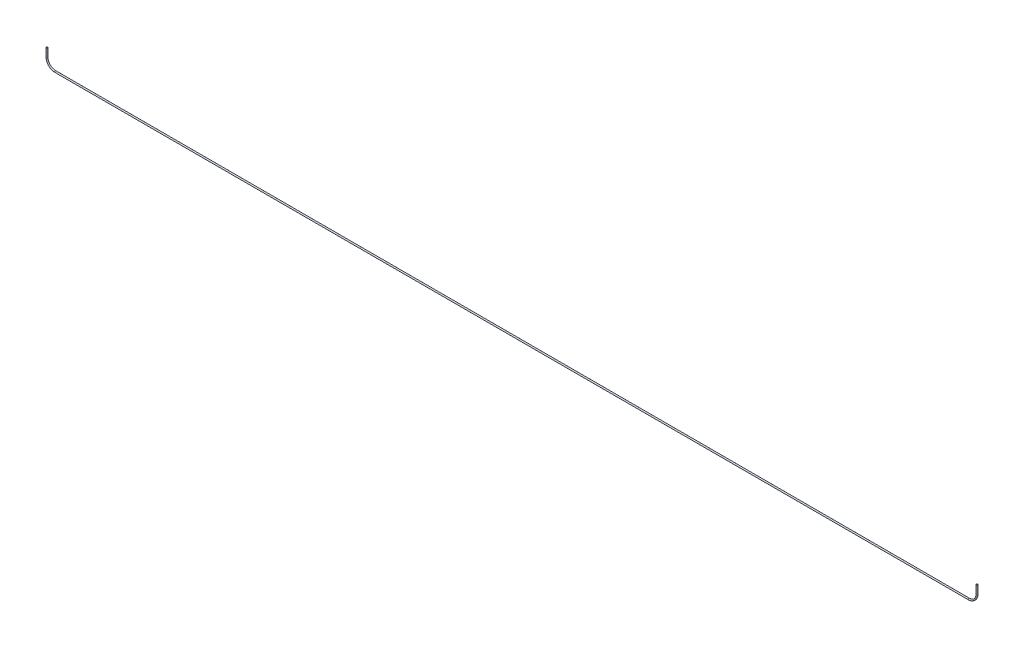
ISO-10303-21;
HEADER;
FILE_DESCRIPTION(('STEP AP214'),'2;1');
FILE_NAME('part.step','',(''),(''),'','','');
FILE_SCHEMA(('AUTOMOTIVE_DESIGN { 1 0 10303 214 1 1 1 1 }'));
ENDSEC;
DATA;
#1=APPLICATION_CONTEXT('core data for automotive mechanical design processes');
#2=APPLICATION_PROTOCOL_DEFINITION('international standard','automotive_design',2000,#1);
#3=PRODUCT_CONTEXT('',#1,'mechanical');
#4=PRODUCT('Part','Part','',(#3));
#5=PRODUCT_RELATED_PRODUCT_CATEGORY('part','',(#4));
#6=PRODUCT_DEFINITION_FORMATION('','',#4);
#7=PRODUCT_DEFINITION_CONTEXT('part definition',#1,'design');
#8=PRODUCT_DEFINITION('design','',#6,#7);
#9=PRODUCT_DEFINITION_SHAPE('','',#8);
#10=(LENGTH_UNIT() NAMED_UNIT(*) SI_UNIT(.MILLI.,.METRE.));
#11=(NAMED_UNIT(*) PLANE_ANGLE_UNIT() SI_UNIT($,.RADIAN.));
#12=(NAMED_UNIT(*) SI_UNIT($,.STERADIAN.) SOLID_ANGLE_UNIT());
#13=UNCERTAINTY_MEASURE_WITH_UNIT(LENGTH_MEASURE(1.E-05),#10,'distance_accuracy_value','');
#14=(GEOMETRIC_REPRESENTATION_CONTEXT(3) GLOBAL_UNCERTAINTY_ASSIGNED_CONTEXT((#13)) GLOBAL_UNIT_ASSIGNED_CONTEXT((#10,
#11,#12)) REPRESENTATION_CONTEXT('',''));
#15=CARTESIAN_POINT('',(0.,0.,0.));
#16=DIRECTION('',(0.,0.,1.));
#17=DIRECTION('',(1.,0.,0.));
#18=AXIS2_PLACEMENT_3D('',#15,#16,#17);
#19=CARTESIAN_POINT('',(-4200.,149.999999999999,0.));
#20=DIRECTION('',(0.,1.,0.));
#21=DIRECTION('',(0.,0.,-1.));
#22=AXIS2_PLACEMENT_3D('',#19,#20,#21);
#23=PLANE('',#22);
#24=CARTESIAN_POINT('',(-4200.,149.999999999999,0.));
#25=DIRECTION('',(0.,1.,0.));
#26=DIRECTION('',(0.,0.,-1.));
#27=AXIS2_PLACEMENT_3D('',#24,#25,#26);
#28=CIRCLE('',#27,6.3500000000003);
#29=CARTESIAN_POINT('',(-4200.,149.999999999999,-6.3500000000003));
#30=VERTEX_POINT('',#29);
#31=EDGE_CURVE('E69',#30,#30,#28,.T.);
#32=ORIENTED_EDGE('',*,*,#31,.T.);
#33=EDGE_LOOP('',(#32));
#34=FACE_BOUND('',#33,.T.);
#35=ADVANCED_FACE('F47',(#34),#23,.T.);
#36=CARTESIAN_POINT('',(4200.,150.,0.));
#37=DIRECTION('',(0.,-1.,0.));
#38=DIRECTION('',(0.,0.,-1.));
#39=AXIS2_PLACEMENT_3D('',#36,#37,#38);
#40=PLANE('',#39);
#41=CARTESIAN_POINT('',(4200.,150.,0.));
#42=DIRECTION('',(0.,-1.,0.));
#43=DIRECTION('',(0.,0.,-1.));
#44=AXIS2_PLACEMENT_3D('',#41,#42,#43);
#45=CIRCLE('',#44,6.3500000000003);
#46=CARTESIAN_POINT('',(4200.,150.,-6.3500000000003));
#47=VERTEX_POINT('',#46);
#48=EDGE_CURVE('E11',#47,#47,#45,.T.);
#49=ORIENTED_EDGE('',*,*,#48,.F.);
#50=EDGE_LOOP('',(#49));
#51=FACE_BOUND('',#50,.T.);
#52=ADVANCED_FACE('F77',(#51),#40,.F.);
#53=CARTESIAN_POINT('',(-4200.,149.999999999999,0.));
#54=DIRECTION('',(0.,-1.,0.));
#55=DIRECTION('',(0.,0.,-1.));
#56=AXIS2_PLACEMENT_3D('',#53,#54,#55);
#57=CYLINDRICAL_SURFACE('',#56,6.3500000000003);
#58=CARTESIAN_POINT('',(-4200.,74.999999999999,0.));
#59=DIRECTION('',(0.,1.,0.));
#60=DIRECTION('',(0.,0.,-1.));
#61=AXIS2_PLACEMENT_3D('',#58,#59,#60);
#62=CIRCLE('',#61,6.3500000000003);
#63=CARTESIAN_POINT('',(-4206.35,74.999999999999,0.));
#64=VERTEX_POINT('',#63);
#65=EDGE_CURVE('E66',#64,#64,#62,.T.);
#66=ORIENTED_EDGE('',*,*,#65,.T.);
#67=EDGE_LOOP('',(#66));
#68=FACE_BOUND('',#67,.T.);
#69=ORIENTED_EDGE('',*,*,#31,.F.);
#70=EDGE_LOOP('',(#69));
#71=FACE_BOUND('',#70,.T.);
#72=ADVANCED_FACE('F74',(#68,#71),#57,.T.);
#73=CARTESIAN_POINT('',(-4125.,74.999999999999,0.));
#74=DIRECTION('',(0.,0.,1.));
#75=DIRECTION('',(1.,0.,0.));
#76=AXIS2_PLACEMENT_3D('',#73,#74,#75);
#77=TOROIDAL_SURFACE('',#76,75.0000000000002,6.3500000000003);
#78=CARTESIAN_POINT('',(-4125.,-8.88178419700125E-13,0.));
#79=DIRECTION('',(-1.,0.,0.));
#80=DIRECTION('',(0.,0.,-1.));
#81=AXIS2_PLACEMENT_3D('',#78,#79,#80);
#82=CIRCLE('',#81,6.3500000000003);
#83=CARTESIAN_POINT('',(-4125.,-6.35000000000147,0.));
#84=VERTEX_POINT('',#83);
#85=EDGE_CURVE('E61',#84,#84,#82,.T.);
#86=CARTESIAN_POINT('',(-4125.,74.999999999999,0.));
#87=DIRECTION('',(0.,0.,1.));
#88=DIRECTION('',(1.,0.,0.));
#89=AXIS2_PLACEMENT_3D('',#86,#87,#88);
#90=CIRCLE('',#89,81.3500000000005);
#91=EDGE_CURVE('',#64,#84,#90,.T.);
#92=ORIENTED_EDGE('',*,*,#65,.F.);
#93=ORIENTED_EDGE('',*,*,#85,.T.);
#94=ORIENTED_EDGE('',*,*,#91,.T.);
#95=ORIENTED_EDGE('',*,*,#91,.F.);
#96=EDGE_LOOP('',(#92,#94,#93,#95));
#97=FACE_BOUND('',#96,.T.);
#98=ADVANCED_FACE('F76',(#97),#77,.T.);
#99=CARTESIAN_POINT('',(-4125.,-8.88178419700125E-13,0.));
#100=DIRECTION('',(1.,0.,0.));
#101=DIRECTION('',(0.,1.,0.));
#102=AXIS2_PLACEMENT_3D('',#99,#100,#101);
#103=CYLINDRICAL_SURFACE('',#102,6.3500000000003);
#104=CARTESIAN_POINT('',(4125.,0.,0.));
#105=DIRECTION('',(-1.,0.,0.));
#106=DIRECTION('',(0.,0.,-1.));
#107=AXIS2_PLACEMENT_3D('',#104,#105,#106);
#108=CIRCLE('',#107,6.3500000000003);
#109=CARTESIAN_POINT('',(4125.,-6.3500000000003,0.));
#110=VERTEX_POINT('',#109);
#111=EDGE_CURVE('E57',#110,#110,#108,.T.);
#112=ORIENTED_EDGE('',*,*,#111,.T.);
#113=EDGE_LOOP('',(#112));
#114=FACE_BOUND('',#113,.T.);
#115=ORIENTED_EDGE('',*,*,#85,.F.);
#116=EDGE_LOOP('',(#115));
#117=FACE_BOUND('',#116,.T.);
#118=ADVANCED_FACE('F84',(#114,#117),#103,.T.);
#119=CARTESIAN_POINT('',(4125.,75.,0.));
#120=DIRECTION('',(0.,0.,1.));
#121=DIRECTION('',(1.,0.,0.));
#122=AXIS2_PLACEMENT_3D('',#119,#120,#121);
#123=TOROIDAL_SURFACE('',#122,75.,6.3500000000003);
#124=CARTESIAN_POINT('',(4200.,75.,0.));
#125=DIRECTION('',(0.,-1.,0.));
#126=DIRECTION('',(0.,0.,-1.));
#127=AXIS2_PLACEMENT_3D('',#124,#125,#126);
#128=CIRCLE('',#127,6.3500000000003);
#129=CARTESIAN_POINT('',(4206.35,75.,0.));
#130=VERTEX_POINT('',#129);
#131=EDGE_CURVE('E53',#130,#130,#128,.T.);
#132=CARTESIAN_POINT('',(4125.,75.,0.));
#133=DIRECTION('',(0.,0.,1.));
#134=DIRECTION('',(1.,0.,0.));
#135=AXIS2_PLACEMENT_3D('',#132,#133,#134);
#136=CIRCLE('',#135,81.3500000000003);
#137=EDGE_CURVE('',#110,#130,#136,.T.);
#138=ORIENTED_EDGE('',*,*,#111,.F.);
#139=ORIENTED_EDGE('',*,*,#131,.T.);
#140=ORIENTED_EDGE('',*,*,#137,.T.);
#141=ORIENTED_EDGE('',*,*,#137,.F.);
#142=EDGE_LOOP('',(#138,#140,#139,#141));
#143=FACE_BOUND('',#142,.T.);
#144=ADVANCED_FACE('F90',(#143),#123,.T.);
#145=CARTESIAN_POINT('',(4200.,75.,0.));
#146=DIRECTION('',(0.,1.,0.));
#147=DIRECTION('',(0.,0.,1.));
#148=AXIS2_PLACEMENT_3D('',#145,#146,#147);
#149=CYLINDRICAL_SURFACE('',#148,6.3500000000003);
#150=ORIENTED_EDGE('',*,*,#48,.T.);
#151=EDGE_LOOP('',(#150));
#152=FACE_BOUND('',#151,.T.);
#153=ORIENTED_EDGE('',*,*,#131,.F.);
#154=EDGE_LOOP('',(#153));
#155=FACE_BOUND('',#154,.T.);
#156=ADVANCED_FACE('F88',(#152,#155),#149,.T.);
#157=CLOSED_SHELL('',(#35,#52,#72,#98,#118,#144,#156));
#158=MANIFOLD_SOLID_BREP('B2',#157);
#159=ADVANCED_BREP_SHAPE_REPRESENTATION('',(#18,#158),#14);
#160=SHAPE_DEFINITION_REPRESENTATION(#9,#159);
ENDSEC;
END-ISO-10303-21;
